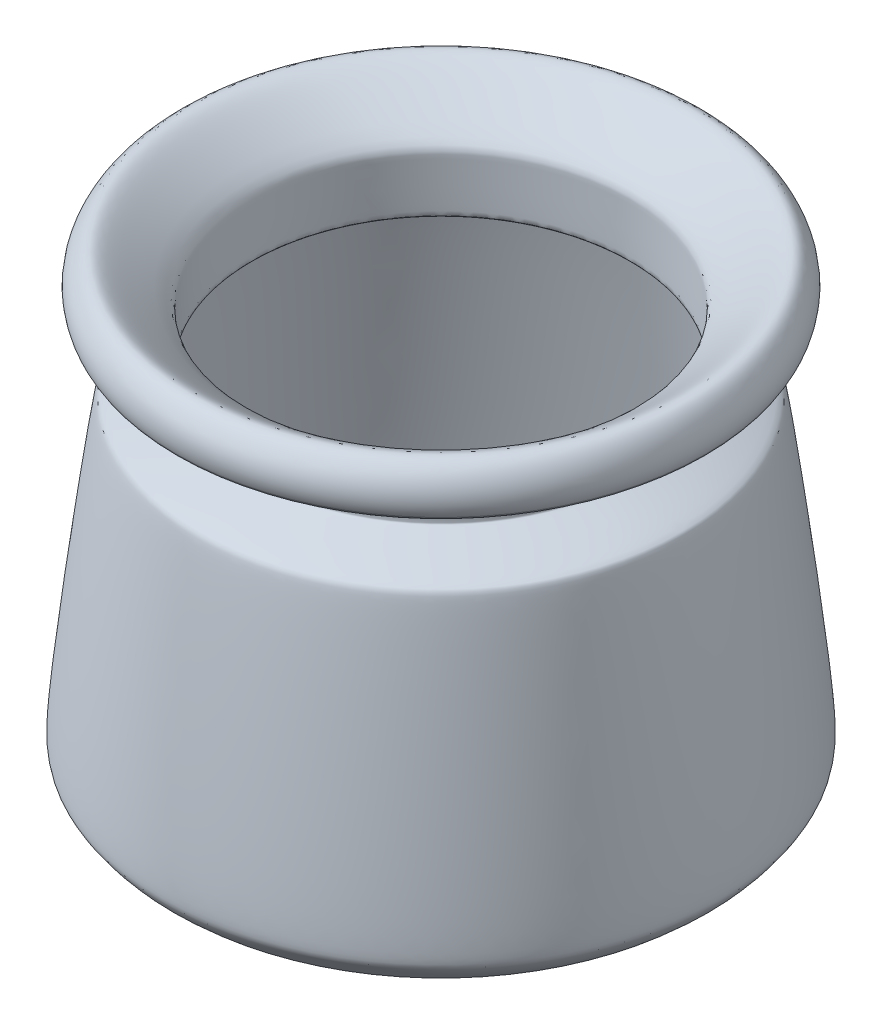
ISO-10303-21;
HEADER;
FILE_DESCRIPTION(('STEP AP214'),'2;1');
FILE_NAME('part.step','',(''),(''),'','','');
FILE_SCHEMA(('AUTOMOTIVE_DESIGN { 1 0 10303 214 1 1 1 1 }'));
ENDSEC;
DATA;
#1=APPLICATION_CONTEXT('core data for automotive mechanical design processes');
#2=APPLICATION_PROTOCOL_DEFINITION('international standard','automotive_design',2000,#1);
#3=PRODUCT_CONTEXT('',#1,'mechanical');
#4=PRODUCT('Part','Part','',(#3));
#5=PRODUCT_RELATED_PRODUCT_CATEGORY('part','',(#4));
#6=PRODUCT_DEFINITION_FORMATION('','',#4);
#7=PRODUCT_DEFINITION_CONTEXT('part definition',#1,'design');
#8=PRODUCT_DEFINITION('design','',#6,#7);
#9=PRODUCT_DEFINITION_SHAPE('','',#8);
#10=(LENGTH_UNIT() NAMED_UNIT(*) SI_UNIT(.MILLI.,.METRE.));
#11=(NAMED_UNIT(*) PLANE_ANGLE_UNIT() SI_UNIT($,.RADIAN.));
#12=(NAMED_UNIT(*) SI_UNIT($,.STERADIAN.) SOLID_ANGLE_UNIT());
#13=UNCERTAINTY_MEASURE_WITH_UNIT(LENGTH_MEASURE(1.E-05),#10,'distance_accuracy_value','');
#14=(GEOMETRIC_REPRESENTATION_CONTEXT(3) GLOBAL_UNCERTAINTY_ASSIGNED_CONTEXT((#13)) GLOBAL_UNIT_ASSIGNED_CONTEXT((#10,
#11,#12)) REPRESENTATION_CONTEXT('',''));
#15=CARTESIAN_POINT('',(0.,0.,0.));
#16=DIRECTION('',(0.,0.,1.));
#17=DIRECTION('',(1.,0.,0.));
#18=AXIS2_PLACEMENT_3D('',#15,#16,#17);
#19=CARTESIAN_POINT('',(0.00154347095915724,-254.146537270377,0.));
#20=CARTESIAN_POINT('',(109.30819357857,-254.062181256503,0.));
#21=CARTESIAN_POINT('',(126.762760210604,-254.188849595522,0.));
#22=CARTESIAN_POINT('',(149.968168963314,-254.167501270587,0.));
#23=CARTESIAN_POINT('',(231.441882243062,-247.633224858192,0.));
#24=CARTESIAN_POINT('',(247.811560945174,-240.842200025711,0.));
#25=CARTESIAN_POINT('',(259.86902580106,-226.092133317017,0.));
#26=CARTESIAN_POINT('',(267.178048812021,-210.911635216219,0.));
#27=CARTESIAN_POINT('',(233.020159330081,59.0040082973661,0.));
#28=CARTESIAN_POINT('',(226.762558506539,67.3371385628237,0.));
#29=CARTESIAN_POINT('',(180.38229517093,83.5415105559582,0.));
#30=CARTESIAN_POINT('',(179.229927819628,84.4600958431682,0.));
#31=CARTESIAN_POINT('',(179.78256189313,128.471590049428,0.));
#32=CARTESIAN_POINT('',(179.764253938206,137.93432468671,0.));
#33=CARTESIAN_POINT('',(187.747666437931,145.801366206595,0.));
#34=CARTESIAN_POINT('',(225.11918354654,175.239024272011,0.));
#35=CARTESIAN_POINT('',(232.541822406211,178.563500310859,0.));
#36=CARTESIAN_POINT('',(245.241696189715,175.770744269923,0.));
#37=CARTESIAN_POINT('',(256.933544306663,152.470678541261,0.));
#38=CARTESIAN_POINT('',(246.379999999997,137.30101127225,0.));
#39=B_SPLINE_CURVE_WITH_KNOTS('',3,(#19,#20,#21,#22,#23,#24,#25,#26,#27,#28,#29,#30,#31,#32,#33,
#34,#35,#36,#37,#38),.UNSPECIFIED.,.F.,.F.,(4,1,1,1,1,1,1,1,1,1,1,1,1,1,1,1,1,4),
(3.67056854003143E-07,0.0779841844655971,0.094799040040034,0.159998609554998,0.179903000102482,
0.273938554967391,0.302112693951075,0.433470250955646,0.462409673799311,0.562567499544065,
0.584872301994679,0.663152895854836,0.680356396382765,0.739703806746038,0.755891492045708,
0.826045564079797,0.851333340775651,1.),.UNSPECIFIED.);
#40=CARTESIAN_POINT('',(0.,217.604569272898,0.));
#41=DIRECTION('',(0.,1.,0.));
#42=AXIS1_PLACEMENT('',#40,#41);
#43=SURFACE_OF_REVOLUTION('',#39,#42);
#44=OFFSET_SURFACE('',#43,-1.999996,.F.);
#45=CARTESIAN_POINT('',(0.,-252.146541865954,0.));
#46=VERTEX_POINT('',#45);
#47=VERTEX_LOOP('',#46);
#48=FACE_BOUND('',#47,.T.);
#49=CARTESIAN_POINT('',(0.,139.301007272254,0.));
#50=DIRECTION('',(0.,-1.,0.));
#51=DIRECTION('',(0.,0.,-1.));
#52=AXIS2_PLACEMENT_3D('',#49,#50,#51);
#53=CIRCLE('',#52,249.912234218705);
#54=CARTESIAN_POINT('',(0.,139.301007272254,-249.912234218705));
#55=VERTEX_POINT('',#54);
#56=EDGE_CURVE('E58',#55,#55,#53,.T.);
#57=ORIENTED_EDGE('',*,*,#56,.F.);
#58=EDGE_LOOP('',(#57));
#59=FACE_BOUND('',#58,.T.);
#60=ADVANCED_FACE('F38',(#48,#59),#44,.F.);
#61=CARTESIAN_POINT('',(0.,137.301011272254,0.));
#62=DIRECTION('',(0.,1.,0.));
#63=DIRECTION('',(0.,0.,1.));
#64=AXIS2_PLACEMENT_3D('',#61,#62,#63);
#65=CONICAL_SURFACE('',#64,248.677932842688,0.552935837834841);
#66=CARTESIAN_POINT('',(0.,137.662818133202,0.));
#67=DIRECTION('',(0.,1.,0.));
#68=DIRECTION('',(0.,0.,1.));
#69=AXIS2_PLACEMENT_3D('',#66,#67,#68);
#70=CIRCLE('',#69,248.901222642428);
#71=CARTESIAN_POINT('',(0.,137.662818133202,248.901222642428));
#72=VERTEX_POINT('',#71);
#73=EDGE_CURVE('E46',#72,#72,#70,.T.);
#74=ORIENTED_EDGE('',*,*,#73,.T.);
#75=EDGE_LOOP('',(#74));
#76=FACE_BOUND('',#75,.T.);
#77=ORIENTED_EDGE('',*,*,#56,.T.);
#78=EDGE_LOOP('',(#77));
#79=FACE_BOUND('',#78,.T.);
#80=ADVANCED_FACE('F54',(#76,#79),#65,.T.);
#81=CARTESIAN_POINT('',(246.38,137.301011272254,0.));
#82=DIRECTION('',(0.,1.,0.));
#83=DIRECTION('',(0.,0.,1.));
#84=AXIS2_PLACEMENT_3D('',#81,#82,#83);
#85=PLANE('',#84);
#86=CARTESIAN_POINT('',(0.,137.301011272254,0.));
#87=DIRECTION('',(0.,1.,0.));
#88=DIRECTION('',(0.,0.,1.));
#89=AXIS2_PLACEMENT_3D('',#86,#87,#88);
#90=CIRCLE('',#89,248.252771062543);
#91=CARTESIAN_POINT('',(0.,137.301011272254,248.252771062543));
#92=VERTEX_POINT('',#91);
#93=EDGE_CURVE('E63',#92,#92,#90,.F.);
#94=ORIENTED_EDGE('',*,*,#93,.T.);
#95=EDGE_LOOP('',(#94));
#96=FACE_BOUND('',#95,.T.);
#97=CARTESIAN_POINT('',(0.,137.301011272254,0.));
#98=DIRECTION('',(0.,1.,0.));
#99=DIRECTION('',(0.,0.,1.));
#100=AXIS2_PLACEMENT_3D('',#97,#98,#99);
#101=CIRCLE('',#100,247.791636551323);
#102=CARTESIAN_POINT('',(0.,137.301011272254,247.791636551323));
#103=VERTEX_POINT('',#102);
#104=EDGE_CURVE('E60',#103,#103,#101,.T.);
#105=ORIENTED_EDGE('',*,*,#104,.T.);
#106=EDGE_LOOP('',(#105));
#107=FACE_BOUND('',#106,.T.);
#108=ADVANCED_FACE('F80',(#96,#107),#85,.F.);
#109=CARTESIAN_POINT('',(0.,-254.146538461538,0.));
#110=CARTESIAN_POINT('',(109.308058411679,-254.06218027559,0.));
#111=CARTESIAN_POINT('',(126.762706974367,-254.188849644498,0.));
#112=CARTESIAN_POINT('',(149.968168963314,-254.167501270587,0.));
#113=CARTESIAN_POINT('',(231.441882243062,-247.633224858192,0.));
#114=CARTESIAN_POINT('',(247.811560945174,-240.842200025711,0.));
#115=CARTESIAN_POINT('',(259.86902580106,-226.092133317017,0.));
#116=CARTESIAN_POINT('',(267.178048812021,-210.911635216219,0.));
#117=CARTESIAN_POINT('',(233.020159330081,59.0040082973661,0.));
#118=CARTESIAN_POINT('',(226.762558506539,67.3371385628237,0.));
#119=CARTESIAN_POINT('',(180.38229517093,83.5415105559582,0.));
#120=CARTESIAN_POINT('',(179.229927819628,84.4600958431682,0.));
#121=CARTESIAN_POINT('',(179.78256189313,128.471590049428,0.));
#122=CARTESIAN_POINT('',(179.764253938206,137.93432468671,0.));
#123=CARTESIAN_POINT('',(187.747666437931,145.801366206595,0.));
#124=CARTESIAN_POINT('',(225.11918354654,175.239024272011,0.));
#125=CARTESIAN_POINT('',(232.541822406211,178.563500310859,0.));
#126=CARTESIAN_POINT('',(245.241696189715,175.770744269923,0.));
#127=CARTESIAN_POINT('',(256.933544306663,152.470678541261,0.));
#128=CARTESIAN_POINT('',(246.379999999997,137.30101127225,0.));
#129=B_SPLINE_CURVE_WITH_KNOTS('',3,(#109,#110,#111,#112,#113,#114,#115,#116,#117,#118,#119,
#120,#121,#122,#123,#124,#125,#126,#127,#128),.UNSPECIFIED.,.F.,.F.,(4,1,1,1,1,1,1,1,1,1,1,1,1,
1,1,1,1,4),(0.,0.0779841844655971,0.094799040040034,0.159998609554998,0.179903000102482,
0.273938554967391,0.302112693951075,0.433470250955646,0.462409673799311,0.562567499544065,
0.584872301994679,0.663152895854836,0.680356396382765,0.739703806746038,0.755891492045708,
0.826045564079797,0.851333340775651,1.),.UNSPECIFIED.);
#130=CARTESIAN_POINT('',(0.,217.604569272898,0.));
#131=DIRECTION('',(0.,1.,0.));
#132=AXIS1_PLACEMENT('',#130,#131);
#133=SURFACE_OF_REVOLUTION('',#129,#132);
#134=CARTESIAN_POINT('',(0.,138.463921440337,0.));
#135=DIRECTION('',(0.,1.,0.));
#136=DIRECTION('',(0.,0.,1.));
#137=AXIS2_PLACEMENT_3D('',#134,#135,#136);
#138=CIRCLE('',#137,247.143628035077);
#139=CARTESIAN_POINT('',(0.,138.463921440337,247.143628035077));
#140=VERTEX_POINT('',#139);
#141=EDGE_CURVE('E11',#140,#140,#138,.F.);
#142=ORIENTED_EDGE('',*,*,#141,.T.);
#143=EDGE_LOOP('',(#142));
#144=FACE_BOUND('',#143,.T.);
#145=CARTESIAN_POINT('',(0.,-254.146538461538,0.));
#146=VERTEX_POINT('',#145);
#147=VERTEX_LOOP('',#146);
#148=FACE_BOUND('',#147,.T.);
#149=ADVANCED_FACE('F83',(#144,#148),#133,.T.);
#150=CARTESIAN_POINT('',(0.,138.063011272254,0.));
#151=DIRECTION('',(0.,1.,0.));
#152=DIRECTION('',(0.,0.,1.));
#153=AXIS2_PLACEMENT_3D('',#150,#151,#152);
#154=TOROIDAL_SURFACE('',#153,248.252771062543,0.762);
#155=ORIENTED_EDGE('',*,*,#73,.F.);
#156=EDGE_LOOP('',(#155));
#157=FACE_BOUND('',#156,.T.);
#158=ORIENTED_EDGE('',*,*,#93,.F.);
#159=EDGE_LOOP('',(#158));
#160=FACE_BOUND('',#159,.T.);
#161=ADVANCED_FACE('F86',(#157,#160),#154,.T.);
#162=CARTESIAN_POINT('',(0.,138.063011272254,0.));
#163=DIRECTION('',(0.,1.,0.));
#164=DIRECTION('',(0.,0.,1.));
#165=AXIS2_PLACEMENT_3D('',#162,#163,#164);
#166=TOROIDAL_SURFACE('',#165,247.791636551323,0.762);
#167=ORIENTED_EDGE('',*,*,#141,.F.);
#168=EDGE_LOOP('',(#167));
#169=FACE_BOUND('',#168,.T.);
#170=ORIENTED_EDGE('',*,*,#104,.F.);
#171=EDGE_LOOP('',(#170));
#172=FACE_BOUND('',#171,.T.);
#173=ADVANCED_FACE('F40',(#169,#172),#166,.T.);
#174=CLOSED_SHELL('',(#60,#80,#108,#149,#161,#173));
#175=MANIFOLD_SOLID_BREP('B2',#174);
#176=ADVANCED_BREP_SHAPE_REPRESENTATION('',(#18,#175),#14);
#177=SHAPE_DEFINITION_REPRESENTATION(#9,#176);
ENDSEC;
END-ISO-10303-21;
